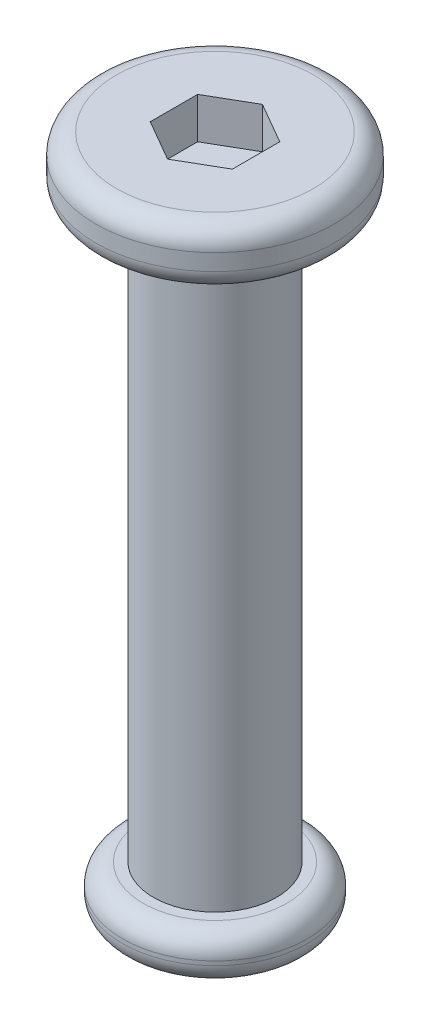
ISO-10303-21;
HEADER;
FILE_DESCRIPTION(('STEP AP214'),'2;1');
FILE_NAME('part.step','',(''),(''),'','','');
FILE_SCHEMA(('AUTOMOTIVE_DESIGN { 1 0 10303 214 1 1 1 1 }'));
ENDSEC;
DATA;
#1=APPLICATION_CONTEXT('core data for automotive mechanical design processes');
#2=APPLICATION_PROTOCOL_DEFINITION('international standard','automotive_design',2000,#1);
#3=PRODUCT_CONTEXT('',#1,'mechanical');
#4=PRODUCT('Part','Part','',(#3));
#5=PRODUCT_RELATED_PRODUCT_CATEGORY('part','',(#4));
#6=PRODUCT_DEFINITION_FORMATION('','',#4);
#7=PRODUCT_DEFINITION_CONTEXT('part definition',#1,'design');
#8=PRODUCT_DEFINITION('design','',#6,#7);
#9=PRODUCT_DEFINITION_SHAPE('','',#8);
#10=(LENGTH_UNIT() NAMED_UNIT(*) SI_UNIT(.MILLI.,.METRE.));
#11=(NAMED_UNIT(*) PLANE_ANGLE_UNIT() SI_UNIT($,.RADIAN.));
#12=(NAMED_UNIT(*) SI_UNIT($,.STERADIAN.) SOLID_ANGLE_UNIT());
#13=UNCERTAINTY_MEASURE_WITH_UNIT(LENGTH_MEASURE(1.E-05),#10,'distance_accuracy_value','');
#14=(GEOMETRIC_REPRESENTATION_CONTEXT(3) GLOBAL_UNCERTAINTY_ASSIGNED_CONTEXT((#13)) GLOBAL_UNIT_ASSIGNED_CONTEXT((#10,
#11,#12)) REPRESENTATION_CONTEXT('',''));
#15=CARTESIAN_POINT('',(0.,0.,0.));
#16=DIRECTION('',(0.,0.,1.));
#17=DIRECTION('',(1.,0.,0.));
#18=AXIS2_PLACEMENT_3D('',#15,#16,#17);
#19=CARTESIAN_POINT('',(0.,1.4,0.));
#20=DIRECTION('',(0.,-1.,0.));
#21=DIRECTION('',(0.,0.,-1.));
#22=AXIS2_PLACEMENT_3D('',#19,#20,#21);
#23=CYLINDRICAL_SURFACE('',#22,2.9);
#24=CARTESIAN_POINT('',(0.,0.9,0.));
#25=DIRECTION('',(0.,1.,0.));
#26=DIRECTION('',(0.,0.,1.));
#27=AXIS2_PLACEMENT_3D('',#24,#25,#26);
#28=CIRCLE('',#27,2.9);
#29=CARTESIAN_POINT('',(0.,0.9,2.9));
#30=VERTEX_POINT('',#29);
#31=EDGE_CURVE('E285',#30,#30,#28,.F.);
#32=ORIENTED_EDGE('',*,*,#31,.T.);
#33=EDGE_LOOP('',(#32));
#34=FACE_BOUND('',#33,.T.);
#35=CARTESIAN_POINT('',(0.,0.5,0.));
#36=DIRECTION('',(0.,1.,0.));
#37=DIRECTION('',(0.,0.,1.));
#38=AXIS2_PLACEMENT_3D('',#35,#36,#37);
#39=CIRCLE('',#38,2.9);
#40=CARTESIAN_POINT('',(0.,0.5,2.9));
#41=VERTEX_POINT('',#40);
#42=EDGE_CURVE('E281',#41,#41,#39,.T.);
#43=ORIENTED_EDGE('',*,*,#42,.T.);
#44=EDGE_LOOP('',(#43));
#45=FACE_BOUND('',#44,.T.);
#46=ADVANCED_FACE('F43',(#34,#45),#23,.T.);
#47=CARTESIAN_POINT('',(0.,1.4,0.));
#48=DIRECTION('',(0.,1.,0.));
#49=DIRECTION('',(0.,0.,1.));
#50=AXIS2_PLACEMENT_3D('',#47,#48,#49);
#51=PLANE('',#50);
#52=CARTESIAN_POINT('',(0.,1.4,0.));
#53=DIRECTION('',(0.,1.,0.));
#54=DIRECTION('',(0.,0.,1.));
#55=AXIS2_PLACEMENT_3D('',#52,#53,#54);
#56=CIRCLE('',#55,2.4);
#57=CARTESIAN_POINT('',(0.,1.4,2.4));
#58=VERTEX_POINT('',#57);
#59=EDGE_CURVE('E213',#58,#58,#56,.T.);
#60=ORIENTED_EDGE('',*,*,#59,.T.);
#61=EDGE_LOOP('',(#60));
#62=FACE_BOUND('',#61,.T.);
#63=DIRECTION('',(0.,0.,-1.));
#64=VECTOR('',#63,1.);
#65=CARTESIAN_POINT('',(1.,1.4,0.577350269189626));
#66=LINE('',#65,#64);
#67=CARTESIAN_POINT('',(1.,1.4,0.577350269189626));
#68=VERTEX_POINT('',#67);
#69=CARTESIAN_POINT('',(1.,1.4,-0.577350269189626));
#70=VERTEX_POINT('',#69);
#71=EDGE_CURVE('E67',#68,#70,#66,.T.);
#72=ORIENTED_EDGE('',*,*,#71,.F.);
#73=DIRECTION('',(0.866025403784439,0.,-0.5));
#74=VECTOR('',#73,1.);
#75=CARTESIAN_POINT('',(0.,1.4,1.15470053837925));
#76=LINE('',#75,#74);
#77=CARTESIAN_POINT('',(0.,1.4,1.15470053837925));
#78=VERTEX_POINT('',#77);
#79=EDGE_CURVE('E220',#78,#68,#76,.T.);
#80=ORIENTED_EDGE('',*,*,#79,.F.);
#81=DIRECTION('',(0.866025403784438,0.,0.5));
#82=VECTOR('',#81,1.);
#83=CARTESIAN_POINT('',(-1.,1.4,0.577350269189626));
#84=LINE('',#83,#82);
#85=CARTESIAN_POINT('',(-1.,1.4,0.577350269189626));
#86=VERTEX_POINT('',#85);
#87=EDGE_CURVE('E255',#86,#78,#84,.T.);
#88=ORIENTED_EDGE('',*,*,#87,.F.);
#89=DIRECTION('',(0.,0.,1.));
#90=VECTOR('',#89,1.);
#91=CARTESIAN_POINT('',(-1.,1.4,-0.577350269189626));
#92=LINE('',#91,#90);
#93=CARTESIAN_POINT('',(-1.,1.4,-0.577350269189626));
#94=VERTEX_POINT('',#93);
#95=EDGE_CURVE('E251',#94,#86,#92,.T.);
#96=ORIENTED_EDGE('',*,*,#95,.F.);
#97=DIRECTION('',(-0.866025403784439,0.,0.5));
#98=VECTOR('',#97,1.);
#99=CARTESIAN_POINT('',(0.,1.4,-1.15470053837925));
#100=LINE('',#99,#98);
#101=CARTESIAN_POINT('',(0.,1.4,-1.15470053837925));
#102=VERTEX_POINT('',#101);
#103=EDGE_CURVE('E247',#102,#94,#100,.T.);
#104=ORIENTED_EDGE('',*,*,#103,.F.);
#105=DIRECTION('',(-0.866025403784438,0.,-0.5));
#106=VECTOR('',#105,1.);
#107=CARTESIAN_POINT('',(1.,1.4,-0.577350269189626));
#108=LINE('',#107,#106);
#109=EDGE_CURVE('E243',#70,#102,#108,.T.);
#110=ORIENTED_EDGE('',*,*,#109,.F.);
#111=EDGE_LOOP('',(#72,#80,#88,#96,#104,#110));
#112=FACE_BOUND('',#111,.T.);
#113=ADVANCED_FACE('F352',(#62,#112),#51,.T.);
#114=CARTESIAN_POINT('',(0.,0.,0.));
#115=DIRECTION('',(0.,1.,0.));
#116=DIRECTION('',(0.,0.,1.));
#117=AXIS2_PLACEMENT_3D('',#114,#115,#116);
#118=PLANE('',#117);
#119=CARTESIAN_POINT('',(0.,0.,0.));
#120=DIRECTION('',(0.,1.,0.));
#121=DIRECTION('',(0.,0.,1.));
#122=AXIS2_PLACEMENT_3D('',#119,#120,#121);
#123=CIRCLE('',#122,2.4);
#124=CARTESIAN_POINT('',(0.,0.,2.4));
#125=VERTEX_POINT('',#124);
#126=EDGE_CURVE('E289',#125,#125,#123,.F.);
#127=ORIENTED_EDGE('',*,*,#126,.T.);
#128=EDGE_LOOP('',(#127));
#129=FACE_BOUND('',#128,.T.);
#130=CARTESIAN_POINT('',(0.,0.,0.));
#131=DIRECTION('',(0.,-1.,0.));
#132=DIRECTION('',(0.,0.,-1.));
#133=AXIS2_PLACEMENT_3D('',#130,#131,#132);
#134=CIRCLE('',#133,1.5);
#135=CARTESIAN_POINT('',(0.,0.,-1.5));
#136=VERTEX_POINT('',#135);
#137=EDGE_CURVE('E209',#136,#136,#134,.T.);
#138=ORIENTED_EDGE('',*,*,#137,.F.);
#139=EDGE_LOOP('',(#138));
#140=FACE_BOUND('',#139,.T.);
#141=ADVANCED_FACE('F358',(#129,#140),#118,.F.);
#142=CARTESIAN_POINT('',(1.,0.4,0.577350269189626));
#143=DIRECTION('',(1.,0.,0.));
#144=DIRECTION('',(0.,0.,-1.));
#145=AXIS2_PLACEMENT_3D('',#142,#143,#144);
#146=PLANE('',#145);
#147=ORIENTED_EDGE('',*,*,#71,.T.);
#148=DIRECTION('',(0.,1.,0.));
#149=VECTOR('',#148,1.);
#150=CARTESIAN_POINT('',(1.,0.4,-0.577350269189626));
#151=LINE('',#150,#149);
#152=CARTESIAN_POINT('',(1.,0.4,-0.577350269189626));
#153=VERTEX_POINT('',#152);
#154=EDGE_CURVE('E240',#153,#70,#151,.T.);
#155=ORIENTED_EDGE('',*,*,#154,.F.);
#156=DIRECTION('',(0.,0.,-1.));
#157=VECTOR('',#156,1.);
#158=CARTESIAN_POINT('',(1.,0.4,0.577350269189626));
#159=LINE('',#158,#157);
#160=CARTESIAN_POINT('',(1.,0.4,0.577350269189626));
#161=VERTEX_POINT('',#160);
#162=EDGE_CURVE('E215',#161,#153,#159,.T.);
#163=ORIENTED_EDGE('',*,*,#162,.F.);
#164=DIRECTION('',(0.,1.,0.));
#165=VECTOR('',#164,1.);
#166=CARTESIAN_POINT('',(1.,0.4,0.577350269189626));
#167=LINE('',#166,#165);
#168=EDGE_CURVE('E214',#161,#68,#167,.T.);
#169=ORIENTED_EDGE('',*,*,#168,.T.);
#170=EDGE_LOOP('',(#147,#155,#163,#169));
#171=FACE_BOUND('',#170,.T.);
#172=ADVANCED_FACE('F378',(#171),#146,.F.);
#173=CARTESIAN_POINT('',(0.,0.4,1.15470053837925));
#174=DIRECTION('',(0.5,0.,0.866025403784439));
#175=DIRECTION('',(0.866025403784439,0.,-0.5));
#176=AXIS2_PLACEMENT_3D('',#173,#174,#175);
#177=PLANE('',#176);
#178=ORIENTED_EDGE('',*,*,#79,.T.);
#179=ORIENTED_EDGE('',*,*,#168,.F.);
#180=DIRECTION('',(0.866025403784439,0.,-0.5));
#181=VECTOR('',#180,1.);
#182=CARTESIAN_POINT('',(0.,0.4,1.15470053837925));
#183=LINE('',#182,#181);
#184=CARTESIAN_POINT('',(0.,0.4,1.15470053837925));
#185=VERTEX_POINT('',#184);
#186=EDGE_CURVE('E236',#185,#161,#183,.T.);
#187=ORIENTED_EDGE('',*,*,#186,.F.);
#188=DIRECTION('',(0.,1.,0.));
#189=VECTOR('',#188,1.);
#190=CARTESIAN_POINT('',(0.,0.4,1.15470053837925));
#191=LINE('',#190,#189);
#192=EDGE_CURVE('E264',#185,#78,#191,.T.);
#193=ORIENTED_EDGE('',*,*,#192,.T.);
#194=EDGE_LOOP('',(#178,#179,#187,#193));
#195=FACE_BOUND('',#194,.T.);
#196=ADVANCED_FACE('F394',(#195),#177,.F.);
#197=CARTESIAN_POINT('',(-1.,0.4,0.577350269189626));
#198=DIRECTION('',(-0.5,0.,0.866025403784439));
#199=DIRECTION('',(0.866025403784438,0.,0.5));
#200=AXIS2_PLACEMENT_3D('',#197,#198,#199);
#201=PLANE('',#200);
#202=ORIENTED_EDGE('',*,*,#87,.T.);
#203=ORIENTED_EDGE('',*,*,#192,.F.);
#204=DIRECTION('',(0.866025403784438,0.,0.5));
#205=VECTOR('',#204,1.);
#206=CARTESIAN_POINT('',(-1.,0.4,0.577350269189626));
#207=LINE('',#206,#205);
#208=CARTESIAN_POINT('',(-1.,0.4,0.577350269189626));
#209=VERTEX_POINT('',#208);
#210=EDGE_CURVE('E232',#209,#185,#207,.T.);
#211=ORIENTED_EDGE('',*,*,#210,.F.);
#212=DIRECTION('',(0.,1.,0.));
#213=VECTOR('',#212,1.);
#214=CARTESIAN_POINT('',(-1.,0.4,0.577350269189626));
#215=LINE('',#214,#213);
#216=EDGE_CURVE('E267',#209,#86,#215,.T.);
#217=ORIENTED_EDGE('',*,*,#216,.T.);
#218=EDGE_LOOP('',(#202,#203,#211,#217));
#219=FACE_BOUND('',#218,.T.);
#220=ADVANCED_FACE('F397',(#219),#201,.F.);
#221=CARTESIAN_POINT('',(-1.,0.4,-0.577350269189626));
#222=DIRECTION('',(-1.,0.,0.));
#223=DIRECTION('',(0.,0.,1.));
#224=AXIS2_PLACEMENT_3D('',#221,#222,#223);
#225=PLANE('',#224);
#226=ORIENTED_EDGE('',*,*,#95,.T.);
#227=ORIENTED_EDGE('',*,*,#216,.F.);
#228=DIRECTION('',(0.,0.,1.));
#229=VECTOR('',#228,1.);
#230=CARTESIAN_POINT('',(-1.,0.4,-0.577350269189626));
#231=LINE('',#230,#229);
#232=CARTESIAN_POINT('',(-1.,0.4,-0.577350269189626));
#233=VERTEX_POINT('',#232);
#234=EDGE_CURVE('E228',#233,#209,#231,.T.);
#235=ORIENTED_EDGE('',*,*,#234,.F.);
#236=DIRECTION('',(0.,1.,0.));
#237=VECTOR('',#236,1.);
#238=CARTESIAN_POINT('',(-1.,0.4,-0.577350269189626));
#239=LINE('',#238,#237);
#240=EDGE_CURVE('E270',#233,#94,#239,.T.);
#241=ORIENTED_EDGE('',*,*,#240,.T.);
#242=EDGE_LOOP('',(#226,#227,#235,#241));
#243=FACE_BOUND('',#242,.T.);
#244=ADVANCED_FACE('F401',(#243),#225,.F.);
#245=CARTESIAN_POINT('',(0.,0.4,-1.15470053837925));
#246=DIRECTION('',(-0.5,0.,-0.866025403784439));
#247=DIRECTION('',(-0.866025403784439,0.,0.5));
#248=AXIS2_PLACEMENT_3D('',#245,#246,#247);
#249=PLANE('',#248);
#250=ORIENTED_EDGE('',*,*,#103,.T.);
#251=ORIENTED_EDGE('',*,*,#240,.F.);
#252=DIRECTION('',(-0.866025403784439,0.,0.5));
#253=VECTOR('',#252,1.);
#254=CARTESIAN_POINT('',(0.,0.4,-1.15470053837925));
#255=LINE('',#254,#253);
#256=CARTESIAN_POINT('',(0.,0.4,-1.15470053837925));
#257=VERTEX_POINT('',#256);
#258=EDGE_CURVE('E224',#257,#233,#255,.T.);
#259=ORIENTED_EDGE('',*,*,#258,.F.);
#260=DIRECTION('',(0.,1.,0.));
#261=VECTOR('',#260,1.);
#262=CARTESIAN_POINT('',(0.,0.4,-1.15470053837925));
#263=LINE('',#262,#261);
#264=EDGE_CURVE('E273',#257,#102,#263,.T.);
#265=ORIENTED_EDGE('',*,*,#264,.T.);
#266=EDGE_LOOP('',(#250,#251,#259,#265));
#267=FACE_BOUND('',#266,.T.);
#268=ADVANCED_FACE('F405',(#267),#249,.F.);
#269=CARTESIAN_POINT('',(1.,0.4,-0.577350269189626));
#270=DIRECTION('',(0.5,0.,-0.866025403784439));
#271=DIRECTION('',(-0.866025403784439,0.,-0.5));
#272=AXIS2_PLACEMENT_3D('',#269,#270,#271);
#273=PLANE('',#272);
#274=ORIENTED_EDGE('',*,*,#109,.T.);
#275=ORIENTED_EDGE('',*,*,#264,.F.);
#276=DIRECTION('',(-0.866025403784438,0.,-0.5));
#277=VECTOR('',#276,1.);
#278=CARTESIAN_POINT('',(1.,0.4,-0.577350269189626));
#279=LINE('',#278,#277);
#280=EDGE_CURVE('E219',#153,#257,#279,.T.);
#281=ORIENTED_EDGE('',*,*,#280,.F.);
#282=ORIENTED_EDGE('',*,*,#154,.T.);
#283=EDGE_LOOP('',(#274,#275,#281,#282));
#284=FACE_BOUND('',#283,.T.);
#285=ADVANCED_FACE('F388',(#284),#273,.F.);
#286=CARTESIAN_POINT('',(0.,0.4,0.));
#287=DIRECTION('',(0.,1.,0.));
#288=DIRECTION('',(0.,0.,1.));
#289=AXIS2_PLACEMENT_3D('',#286,#287,#288);
#290=PLANE('',#289);
#291=ORIENTED_EDGE('',*,*,#162,.T.);
#292=ORIENTED_EDGE('',*,*,#280,.T.);
#293=ORIENTED_EDGE('',*,*,#258,.T.);
#294=ORIENTED_EDGE('',*,*,#234,.T.);
#295=ORIENTED_EDGE('',*,*,#210,.T.);
#296=ORIENTED_EDGE('',*,*,#186,.T.);
#297=EDGE_LOOP('',(#291,#292,#293,#294,#295,#296));
#298=FACE_BOUND('',#297,.T.);
#299=ADVANCED_FACE('F382',(#298),#290,.T.);
#300=CARTESIAN_POINT('',(0.,-14.,0.));
#301=DIRECTION('',(0.,1.,0.));
#302=DIRECTION('',(0.,0.,1.));
#303=AXIS2_PLACEMENT_3D('',#300,#301,#302);
#304=CYLINDRICAL_SURFACE('',#303,1.5);
#305=CARTESIAN_POINT('',(0.,-14.,0.));
#306=DIRECTION('',(0.,-1.,0.));
#307=DIRECTION('',(0.,0.,-1.));
#308=AXIS2_PLACEMENT_3D('',#305,#306,#307);
#309=CIRCLE('',#308,1.5);
#310=CARTESIAN_POINT('',(0.,-14.,-1.5));
#311=VERTEX_POINT('',#310);
#312=EDGE_CURVE('E194',#311,#311,#309,.T.);
#313=ORIENTED_EDGE('',*,*,#312,.F.);
#314=EDGE_LOOP('',(#313));
#315=FACE_BOUND('',#314,.T.);
#316=ORIENTED_EDGE('',*,*,#137,.T.);
#317=EDGE_LOOP('',(#316));
#318=FACE_BOUND('',#317,.T.);
#319=ADVANCED_FACE('F317',(#315,#318),#304,.T.);
#320=CARTESIAN_POINT('',(0.,-15.1,0.));
#321=DIRECTION('',(0.,1.,0.));
#322=DIRECTION('',(0.,0.,1.));
#323=AXIS2_PLACEMENT_3D('',#320,#321,#322);
#324=CYLINDRICAL_SURFACE('',#323,2.25);
#325=CARTESIAN_POINT('',(0.,-14.5,0.));
#326=DIRECTION('',(0.,-1.,0.));
#327=DIRECTION('',(0.,0.,-1.));
#328=AXIS2_PLACEMENT_3D('',#325,#326,#327);
#329=CIRCLE('',#328,2.25);
#330=CARTESIAN_POINT('',(0.,-14.5,-2.25));
#331=VERTEX_POINT('',#330);
#332=EDGE_CURVE('E297',#331,#331,#329,.T.);
#333=ORIENTED_EDGE('',*,*,#332,.T.);
#334=EDGE_LOOP('',(#333));
#335=FACE_BOUND('',#334,.T.);
#336=CARTESIAN_POINT('',(0.,-14.6,0.));
#337=DIRECTION('',(0.,-1.,0.));
#338=DIRECTION('',(0.,0.,-1.));
#339=AXIS2_PLACEMENT_3D('',#336,#337,#338);
#340=CIRCLE('',#339,2.25);
#341=CARTESIAN_POINT('',(0.,-14.6,-2.25));
#342=VERTEX_POINT('',#341);
#343=EDGE_CURVE('E293',#342,#342,#340,.F.);
#344=ORIENTED_EDGE('',*,*,#343,.T.);
#345=EDGE_LOOP('',(#344));
#346=FACE_BOUND('',#345,.T.);
#347=ADVANCED_FACE('F313',(#335,#346),#324,.T.);
#348=CARTESIAN_POINT('',(0.,-15.1,0.));
#349=DIRECTION('',(0.,-1.,0.));
#350=DIRECTION('',(0.,0.,-1.));
#351=AXIS2_PLACEMENT_3D('',#348,#349,#350);
#352=PLANE('',#351);
#353=CARTESIAN_POINT('',(0.,-15.1,0.));
#354=DIRECTION('',(0.,-1.,0.));
#355=DIRECTION('',(0.,0.,-1.));
#356=AXIS2_PLACEMENT_3D('',#353,#354,#355);
#357=CIRCLE('',#356,1.75);
#358=CARTESIAN_POINT('',(0.,-15.1,-1.75));
#359=VERTEX_POINT('',#358);
#360=EDGE_CURVE('E11',#359,#359,#357,.T.);
#361=ORIENTED_EDGE('',*,*,#360,.T.);
#362=EDGE_LOOP('',(#361));
#363=FACE_BOUND('',#362,.T.);
#364=DIRECTION('',(0.,0.,1.));
#365=VECTOR('',#364,1.);
#366=CARTESIAN_POINT('',(0.65,-15.1,-0.375277674973256));
#367=LINE('',#366,#365);
#368=CARTESIAN_POINT('',(0.65,-15.1,-0.375277674973256));
#369=VERTEX_POINT('',#368);
#370=CARTESIAN_POINT('',(0.649999999999999,-15.1,0.375277674973257));
#371=VERTEX_POINT('',#370);
#372=EDGE_CURVE('E59',#369,#371,#367,.T.);
#373=ORIENTED_EDGE('',*,*,#372,.F.);
#374=DIRECTION('',(0.866025403784438,0.,0.500000000000001));
#375=VECTOR('',#374,1.);
#376=CARTESIAN_POINT('',(0.,-15.1,-0.750555349946513));
#377=LINE('',#376,#375);
#378=CARTESIAN_POINT('',(0.,-15.1,-0.750555349946513));
#379=VERTEX_POINT('',#378);
#380=EDGE_CURVE('E157',#379,#369,#377,.T.);
#381=ORIENTED_EDGE('',*,*,#380,.F.);
#382=DIRECTION('',(0.866025403784439,0.,-0.499999999999999));
#383=VECTOR('',#382,1.);
#384=CARTESIAN_POINT('',(-0.649999999999999,-15.1,-0.375277674973257));
#385=LINE('',#384,#383);
#386=CARTESIAN_POINT('',(-0.649999999999999,-15.1,-0.375277674973257));
#387=VERTEX_POINT('',#386);
#388=EDGE_CURVE('E161',#387,#379,#385,.T.);
#389=ORIENTED_EDGE('',*,*,#388,.F.);
#390=DIRECTION('',(0.,0.,-1.));
#391=VECTOR('',#390,1.);
#392=CARTESIAN_POINT('',(-0.65,-15.1,0.375277674973256));
#393=LINE('',#392,#391);
#394=CARTESIAN_POINT('',(-0.65,-15.1,0.375277674973256));
#395=VERTEX_POINT('',#394);
#396=EDGE_CURVE('E184',#395,#387,#393,.T.);
#397=ORIENTED_EDGE('',*,*,#396,.F.);
#398=DIRECTION('',(-0.866025403784438,0.,-0.500000000000001));
#399=VECTOR('',#398,1.);
#400=CARTESIAN_POINT('',(0.,-15.1,0.750555349946514));
#401=LINE('',#400,#399);
#402=CARTESIAN_POINT('',(0.,-15.1,0.750555349946514));
#403=VERTEX_POINT('',#402);
#404=EDGE_CURVE('E180',#403,#395,#401,.T.);
#405=ORIENTED_EDGE('',*,*,#404,.F.);
#406=DIRECTION('',(-0.866025403784439,0.,0.5));
#407=VECTOR('',#406,1.);
#408=CARTESIAN_POINT('',(0.649999999999999,-15.1,0.375277674973257));
#409=LINE('',#408,#407);
#410=EDGE_CURVE('E177',#371,#403,#409,.T.);
#411=ORIENTED_EDGE('',*,*,#410,.F.);
#412=EDGE_LOOP('',(#373,#381,#389,#397,#405,#411));
#413=FACE_BOUND('',#412,.T.);
#414=ADVANCED_FACE('F316',(#363,#413),#352,.T.);
#415=CARTESIAN_POINT('',(0.,-14.,0.));
#416=DIRECTION('',(0.,-1.,0.));
#417=DIRECTION('',(0.,0.,-1.));
#418=AXIS2_PLACEMENT_3D('',#415,#416,#417);
#419=PLANE('',#418);
#420=CARTESIAN_POINT('',(0.,-14.,0.));
#421=DIRECTION('',(0.,-1.,0.));
#422=DIRECTION('',(0.,0.,-1.));
#423=AXIS2_PLACEMENT_3D('',#420,#421,#422);
#424=CIRCLE('',#423,1.75);
#425=CARTESIAN_POINT('',(0.,-14.,-1.75));
#426=VERTEX_POINT('',#425);
#427=EDGE_CURVE('E52',#426,#426,#424,.F.);
#428=ORIENTED_EDGE('',*,*,#427,.T.);
#429=EDGE_LOOP('',(#428));
#430=FACE_BOUND('',#429,.T.);
#431=ORIENTED_EDGE('',*,*,#312,.T.);
#432=EDGE_LOOP('',(#431));
#433=FACE_BOUND('',#432,.T.);
#434=ADVANCED_FACE('F304',(#430,#433),#419,.F.);
#435=CARTESIAN_POINT('',(0.65,-14.3,-0.375277674973256));
#436=DIRECTION('',(1.,0.,0.));
#437=DIRECTION('',(0.,0.,-1.));
#438=AXIS2_PLACEMENT_3D('',#435,#436,#437);
#439=PLANE('',#438);
#440=ORIENTED_EDGE('',*,*,#372,.T.);
#441=DIRECTION('',(0.,-1.,0.));
#442=VECTOR('',#441,1.);
#443=CARTESIAN_POINT('',(0.649999999999999,-14.3,0.375277674973257));
#444=LINE('',#443,#442);
#445=CARTESIAN_POINT('',(0.649999999999999,-14.3,0.375277674973257));
#446=VERTEX_POINT('',#445);
#447=EDGE_CURVE('E131',#446,#371,#444,.T.);
#448=ORIENTED_EDGE('',*,*,#447,.F.);
#449=DIRECTION('',(0.,0.,1.));
#450=VECTOR('',#449,1.);
#451=CARTESIAN_POINT('',(0.65,-14.3,-0.375277674973256));
#452=LINE('',#451,#450);
#453=CARTESIAN_POINT('',(0.65,-14.3,-0.375277674973256));
#454=VERTEX_POINT('',#453);
#455=EDGE_CURVE('E135',#454,#446,#452,.T.);
#456=ORIENTED_EDGE('',*,*,#455,.F.);
#457=DIRECTION('',(0.,-1.,0.));
#458=VECTOR('',#457,1.);
#459=CARTESIAN_POINT('',(0.65,-14.3,-0.375277674973256));
#460=LINE('',#459,#458);
#461=EDGE_CURVE('E191',#454,#369,#460,.T.);
#462=ORIENTED_EDGE('',*,*,#461,.T.);
#463=EDGE_LOOP('',(#440,#448,#456,#462));
#464=FACE_BOUND('',#463,.T.);
#465=ADVANCED_FACE('F133',(#464),#439,.F.);
#466=CARTESIAN_POINT('',(0.,-14.3,-0.750555349946513));
#467=DIRECTION('',(0.500000000000001,0.,-0.866025403784438));
#468=DIRECTION('',(-0.866025403784438,0.,-0.500000000000001));
#469=AXIS2_PLACEMENT_3D('',#466,#467,#468);
#470=PLANE('',#469);
#471=ORIENTED_EDGE('',*,*,#380,.T.);
#472=ORIENTED_EDGE('',*,*,#461,.F.);
#473=DIRECTION('',(0.866025403784438,0.,0.500000000000001));
#474=VECTOR('',#473,1.);
#475=CARTESIAN_POINT('',(0.,-14.3,-0.750555349946513));
#476=LINE('',#475,#474);
#477=CARTESIAN_POINT('',(0.,-14.3,-0.750555349946513));
#478=VERTEX_POINT('',#477);
#479=EDGE_CURVE('E142',#478,#454,#476,.T.);
#480=ORIENTED_EDGE('',*,*,#479,.F.);
#481=DIRECTION('',(0.,-1.,0.));
#482=VECTOR('',#481,1.);
#483=CARTESIAN_POINT('',(0.,-14.3,-0.750555349946513));
#484=LINE('',#483,#482);
#485=EDGE_CURVE('E195',#478,#379,#484,.T.);
#486=ORIENTED_EDGE('',*,*,#485,.T.);
#487=EDGE_LOOP('',(#471,#472,#480,#486));
#488=FACE_BOUND('',#487,.T.);
#489=ADVANCED_FACE('F341',(#488),#470,.F.);
#490=CARTESIAN_POINT('',(-0.649999999999999,-14.3,-0.375277674973257));
#491=DIRECTION('',(-0.5,0.,-0.866025403784439));
#492=DIRECTION('',(-0.866025403784439,0.,0.5));
#493=AXIS2_PLACEMENT_3D('',#490,#491,#492);
#494=PLANE('',#493);
#495=ORIENTED_EDGE('',*,*,#388,.T.);
#496=ORIENTED_EDGE('',*,*,#485,.F.);
#497=DIRECTION('',(0.866025403784439,0.,-0.499999999999999));
#498=VECTOR('',#497,1.);
#499=CARTESIAN_POINT('',(-0.649999999999999,-14.3,-0.375277674973257));
#500=LINE('',#499,#498);
#501=CARTESIAN_POINT('',(-0.649999999999999,-14.3,-0.375277674973257));
#502=VERTEX_POINT('',#501);
#503=EDGE_CURVE('E170',#502,#478,#500,.T.);
#504=ORIENTED_EDGE('',*,*,#503,.F.);
#505=DIRECTION('',(0.,-1.,0.));
#506=VECTOR('',#505,1.);
#507=CARTESIAN_POINT('',(-0.649999999999999,-14.3,-0.375277674973257));
#508=LINE('',#507,#506);
#509=EDGE_CURVE('E198',#502,#387,#508,.T.);
#510=ORIENTED_EDGE('',*,*,#509,.T.);
#511=EDGE_LOOP('',(#495,#496,#504,#510));
#512=FACE_BOUND('',#511,.T.);
#513=ADVANCED_FACE('F339',(#512),#494,.F.);
#514=CARTESIAN_POINT('',(-0.65,-14.3,0.375277674973256));
#515=DIRECTION('',(-1.,0.,0.));
#516=DIRECTION('',(0.,0.,1.));
#517=AXIS2_PLACEMENT_3D('',#514,#515,#516);
#518=PLANE('',#517);
#519=ORIENTED_EDGE('',*,*,#396,.T.);
#520=ORIENTED_EDGE('',*,*,#509,.F.);
#521=DIRECTION('',(0.,0.,-1.));
#522=VECTOR('',#521,1.);
#523=CARTESIAN_POINT('',(-0.65,-14.3,0.375277674973256));
#524=LINE('',#523,#522);
#525=CARTESIAN_POINT('',(-0.65,-14.3,0.375277674973256));
#526=VERTEX_POINT('',#525);
#527=EDGE_CURVE('E166',#526,#502,#524,.T.);
#528=ORIENTED_EDGE('',*,*,#527,.F.);
#529=DIRECTION('',(0.,-1.,0.));
#530=VECTOR('',#529,1.);
#531=CARTESIAN_POINT('',(-0.65,-14.3,0.375277674973256));
#532=LINE('',#531,#530);
#533=EDGE_CURVE('E201',#526,#395,#532,.T.);
#534=ORIENTED_EDGE('',*,*,#533,.T.);
#535=EDGE_LOOP('',(#519,#520,#528,#534));
#536=FACE_BOUND('',#535,.T.);
#537=ADVANCED_FACE('F337',(#536),#518,.F.);
#538=CARTESIAN_POINT('',(0.,-14.3,0.750555349946514));
#539=DIRECTION('',(-0.500000000000001,0.,0.866025403784438));
#540=DIRECTION('',(0.866025403784438,0.,0.500000000000001));
#541=AXIS2_PLACEMENT_3D('',#538,#539,#540);
#542=PLANE('',#541);
#543=ORIENTED_EDGE('',*,*,#404,.T.);
#544=ORIENTED_EDGE('',*,*,#533,.F.);
#545=DIRECTION('',(-0.866025403784438,0.,-0.500000000000001));
#546=VECTOR('',#545,1.);
#547=CARTESIAN_POINT('',(0.,-14.3,0.750555349946514));
#548=LINE('',#547,#546);
#549=CARTESIAN_POINT('',(0.,-14.3,0.750555349946514));
#550=VERTEX_POINT('',#549);
#551=EDGE_CURVE('E151',#550,#526,#548,.T.);
#552=ORIENTED_EDGE('',*,*,#551,.F.);
#553=DIRECTION('',(0.,-1.,0.));
#554=VECTOR('',#553,1.);
#555=CARTESIAN_POINT('',(0.,-14.3,0.750555349946514));
#556=LINE('',#555,#554);
#557=EDGE_CURVE('E141',#550,#403,#556,.T.);
#558=ORIENTED_EDGE('',*,*,#557,.T.);
#559=EDGE_LOOP('',(#543,#544,#552,#558));
#560=FACE_BOUND('',#559,.T.);
#561=ADVANCED_FACE('F333',(#560),#542,.F.);
#562=CARTESIAN_POINT('',(0.649999999999999,-14.3,0.375277674973257));
#563=DIRECTION('',(0.5,0.,0.866025403784439));
#564=DIRECTION('',(0.866025403784439,0.,-0.5));
#565=AXIS2_PLACEMENT_3D('',#562,#563,#564);
#566=PLANE('',#565);
#567=ORIENTED_EDGE('',*,*,#410,.T.);
#568=ORIENTED_EDGE('',*,*,#557,.F.);
#569=DIRECTION('',(-0.866025403784439,0.,0.5));
#570=VECTOR('',#569,1.);
#571=CARTESIAN_POINT('',(0.649999999999999,-14.3,0.375277674973257));
#572=LINE('',#571,#570);
#573=EDGE_CURVE('E145',#446,#550,#572,.T.);
#574=ORIENTED_EDGE('',*,*,#573,.F.);
#575=ORIENTED_EDGE('',*,*,#447,.T.);
#576=EDGE_LOOP('',(#567,#568,#574,#575));
#577=FACE_BOUND('',#576,.T.);
#578=ADVANCED_FACE('F146',(#577),#566,.F.);
#579=CARTESIAN_POINT('',(0.,-14.3,0.));
#580=DIRECTION('',(0.,-1.,0.));
#581=DIRECTION('',(0.,0.,-1.));
#582=AXIS2_PLACEMENT_3D('',#579,#580,#581);
#583=PLANE('',#582);
#584=ORIENTED_EDGE('',*,*,#455,.T.);
#585=ORIENTED_EDGE('',*,*,#573,.T.);
#586=ORIENTED_EDGE('',*,*,#551,.T.);
#587=ORIENTED_EDGE('',*,*,#527,.T.);
#588=ORIENTED_EDGE('',*,*,#503,.T.);
#589=ORIENTED_EDGE('',*,*,#479,.T.);
#590=EDGE_LOOP('',(#584,#585,#586,#587,#588,#589));
#591=FACE_BOUND('',#590,.T.);
#592=ADVANCED_FACE('F153',(#591),#583,.T.);
#593=CARTESIAN_POINT('',(0.,0.9,0.));
#594=DIRECTION('',(0.,1.,0.));
#595=DIRECTION('',(0.,0.,1.));
#596=AXIS2_PLACEMENT_3D('',#593,#594,#595);
#597=TOROIDAL_SURFACE('',#596,2.4,0.5);
#598=ORIENTED_EDGE('',*,*,#31,.F.);
#599=EDGE_LOOP('',(#598));
#600=FACE_BOUND('',#599,.T.);
#601=ORIENTED_EDGE('',*,*,#59,.F.);
#602=EDGE_LOOP('',(#601));
#603=FACE_BOUND('',#602,.T.);
#604=ADVANCED_FACE('F364',(#600,#603),#597,.T.);
#605=CARTESIAN_POINT('',(0.,0.5,0.));
#606=DIRECTION('',(0.,1.,0.));
#607=DIRECTION('',(0.,0.,1.));
#608=AXIS2_PLACEMENT_3D('',#605,#606,#607);
#609=TOROIDAL_SURFACE('',#608,2.4,0.5);
#610=ORIENTED_EDGE('',*,*,#126,.F.);
#611=EDGE_LOOP('',(#610));
#612=FACE_BOUND('',#611,.T.);
#613=ORIENTED_EDGE('',*,*,#42,.F.);
#614=EDGE_LOOP('',(#613));
#615=FACE_BOUND('',#614,.T.);
#616=ADVANCED_FACE('F310',(#612,#615),#609,.T.);
#617=CARTESIAN_POINT('',(0.,-14.5,0.));
#618=DIRECTION('',(0.,-1.,0.));
#619=DIRECTION('',(0.,0.,-1.));
#620=AXIS2_PLACEMENT_3D('',#617,#618,#619);
#621=TOROIDAL_SURFACE('',#620,1.75,0.5);
#622=ORIENTED_EDGE('',*,*,#427,.F.);
#623=EDGE_LOOP('',(#622));
#624=FACE_BOUND('',#623,.T.);
#625=ORIENTED_EDGE('',*,*,#332,.F.);
#626=EDGE_LOOP('',(#625));
#627=FACE_BOUND('',#626,.T.);
#628=ADVANCED_FACE('F307',(#624,#627),#621,.T.);
#629=CARTESIAN_POINT('',(0.,-14.6,0.));
#630=DIRECTION('',(0.,-1.,0.));
#631=DIRECTION('',(0.,0.,-1.));
#632=AXIS2_PLACEMENT_3D('',#629,#630,#631);
#633=TOROIDAL_SURFACE('',#632,1.75,0.5);
#634=ORIENTED_EDGE('',*,*,#343,.F.);
#635=EDGE_LOOP('',(#634));
#636=FACE_BOUND('',#635,.T.);
#637=ORIENTED_EDGE('',*,*,#360,.F.);
#638=EDGE_LOOP('',(#637));
#639=FACE_BOUND('',#638,.T.);
#640=ADVANCED_FACE('F45',(#636,#639),#633,.T.);
#641=CLOSED_SHELL('',(#46,#113,#141,#172,#196,#220,#244,#268,#285,#299,#319,#347,#414,#434,#465,
#489,#513,#537,#561,#578,#592,#604,#616,#628,#640));
#642=MANIFOLD_SOLID_BREP('B2',#641);
#643=ADVANCED_BREP_SHAPE_REPRESENTATION('',(#18,#642),#14);
#644=SHAPE_DEFINITION_REPRESENTATION(#9,#643);
ENDSEC;
END-ISO-10303-21;
